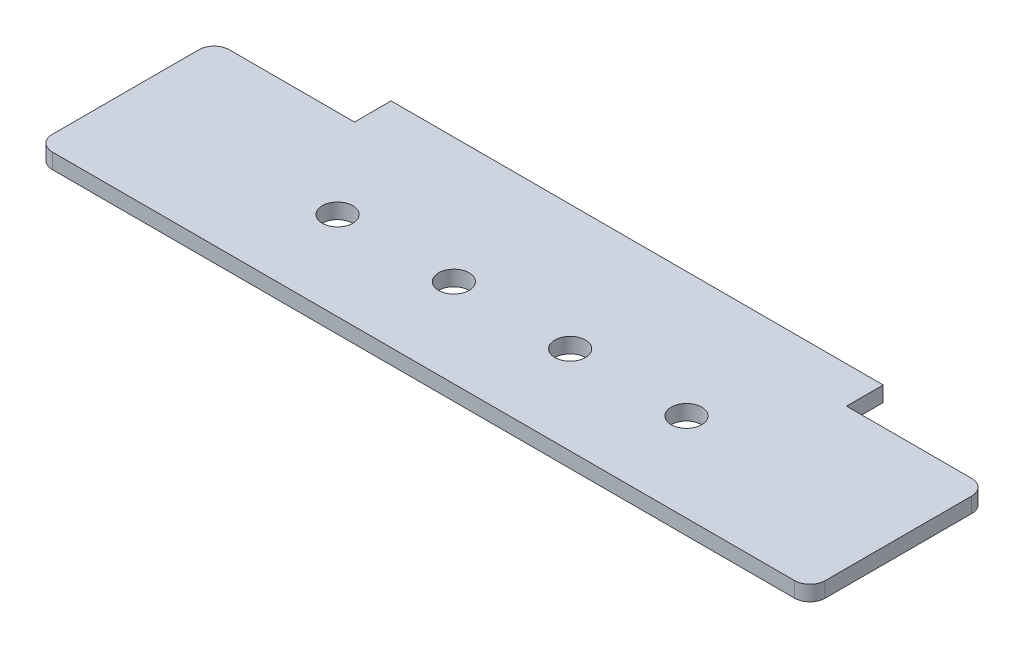
ISO-10303-21;
HEADER;
FILE_DESCRIPTION(('STEP AP214'),'2;1');
FILE_NAME('part.step','',(''),(''),'','','');
FILE_SCHEMA(('AUTOMOTIVE_DESIGN { 1 0 10303 214 1 1 1 1 }'));
ENDSEC;
DATA;
#1=APPLICATION_CONTEXT('core data for automotive mechanical design processes');
#2=APPLICATION_PROTOCOL_DEFINITION('international standard','automotive_design',2000,#1);
#3=PRODUCT_CONTEXT('',#1,'mechanical');
#4=PRODUCT('Part','Part','',(#3));
#5=PRODUCT_RELATED_PRODUCT_CATEGORY('part','',(#4));
#6=PRODUCT_DEFINITION_FORMATION('','',#4);
#7=PRODUCT_DEFINITION_CONTEXT('part definition',#1,'design');
#8=PRODUCT_DEFINITION('design','',#6,#7);
#9=PRODUCT_DEFINITION_SHAPE('','',#8);
#10=(LENGTH_UNIT() NAMED_UNIT(*) SI_UNIT(.MILLI.,.METRE.));
#11=(NAMED_UNIT(*) PLANE_ANGLE_UNIT() SI_UNIT($,.RADIAN.));
#12=(NAMED_UNIT(*) SI_UNIT($,.STERADIAN.) SOLID_ANGLE_UNIT());
#13=UNCERTAINTY_MEASURE_WITH_UNIT(LENGTH_MEASURE(1.E-05),#10,'distance_accuracy_value','');
#14=(GEOMETRIC_REPRESENTATION_CONTEXT(3) GLOBAL_UNCERTAINTY_ASSIGNED_CONTEXT((#13)) GLOBAL_UNIT_ASSIGNED_CONTEXT((#10,
#11,#12)) REPRESENTATION_CONTEXT('',''));
#15=CARTESIAN_POINT('',(0.,0.,0.));
#16=DIRECTION('',(0.,0.,1.));
#17=DIRECTION('',(1.,0.,0.));
#18=AXIS2_PLACEMENT_3D('',#15,#16,#17);
#19=CARTESIAN_POINT('',(-6.44499999999996,0.5,-2.40000000000001));
#20=DIRECTION('',(0.,1.,0.));
#21=DIRECTION('',(0.,0.,1.));
#22=AXIS2_PLACEMENT_3D('',#19,#20,#21);
#23=PLANE('',#22);
#24=CARTESIAN_POINT('',(7.62000000000001,0.5,0.));
#25=DIRECTION('',(0.,1.,0.));
#26=DIRECTION('',(0.,0.,1.));
#27=AXIS2_PLACEMENT_3D('',#24,#25,#26);
#28=CIRCLE('',#27,0.499999999999999);
#29=CARTESIAN_POINT('',(7.62000000000001,0.5,0.499999999999999));
#30=VERTEX_POINT('',#29);
#31=EDGE_CURVE('E332',#30,#30,#28,.T.);
#32=ORIENTED_EDGE('',*,*,#31,.F.);
#33=EDGE_LOOP('',(#32));
#34=FACE_BOUND('',#33,.T.);
#35=CARTESIAN_POINT('',(0.,0.5,0.));
#36=DIRECTION('',(0.,1.,0.));
#37=DIRECTION('',(0.,0.,1.));
#38=AXIS2_PLACEMENT_3D('',#35,#36,#37);
#39=CIRCLE('',#38,0.499999999999999);
#40=CARTESIAN_POINT('',(0.,0.5,0.499999999999999));
#41=VERTEX_POINT('',#40);
#42=EDGE_CURVE('E170',#41,#41,#39,.T.);
#43=ORIENTED_EDGE('',*,*,#42,.F.);
#44=EDGE_LOOP('',(#43));
#45=FACE_BOUND('',#44,.T.);
#46=DIRECTION('',(0.,0.,1.));
#47=VECTOR('',#46,1.);
#48=CARTESIAN_POINT('',(-2.34499999999997,0.5,-4.10000000000001));
#49=LINE('',#48,#47);
#50=CARTESIAN_POINT('',(-2.34499999999997,0.5,-4.10000000000001));
#51=VERTEX_POINT('',#50);
#52=CARTESIAN_POINT('',(-2.34499999999997,0.5,-2.89999999999999));
#53=VERTEX_POINT('',#52);
#54=EDGE_CURVE('E200',#51,#53,#49,.T.);
#55=ORIENTED_EDGE('',*,*,#54,.T.);
#56=DIRECTION('',(-1.,0.,0.));
#57=VECTOR('',#56,1.);
#58=CARTESIAN_POINT('',(-6.44499999999996,0.5,-2.90000000000001));
#59=LINE('',#58,#57);
#60=CARTESIAN_POINT('',(-6.44499999999996,0.5,-2.90000000000001));
#61=VERTEX_POINT('',#60);
#62=EDGE_CURVE('E112',#53,#61,#59,.T.);
#63=ORIENTED_EDGE('',*,*,#62,.T.);
#64=CARTESIAN_POINT('',(-6.44499999999996,0.5,-2.40000000000001));
#65=DIRECTION('',(0.,1.,0.));
#66=DIRECTION('',(0.,0.,1.));
#67=AXIS2_PLACEMENT_3D('',#64,#65,#66);
#68=CIRCLE('',#67,0.5);
#69=CARTESIAN_POINT('',(-6.94499999999996,0.5,-2.40000000000001));
#70=VERTEX_POINT('',#69);
#71=EDGE_CURVE('E237',#61,#70,#68,.T.);
#72=ORIENTED_EDGE('',*,*,#71,.T.);
#73=DIRECTION('',(0.,0.,1.));
#74=VECTOR('',#73,1.);
#75=CARTESIAN_POINT('',(-6.94499999999996,0.5,-2.40000000000001));
#76=LINE('',#75,#74);
#77=CARTESIAN_POINT('',(-6.94499999999996,0.5,2.39999999999998));
#78=VERTEX_POINT('',#77);
#79=EDGE_CURVE('E257',#70,#78,#76,.T.);
#80=ORIENTED_EDGE('',*,*,#79,.T.);
#81=CARTESIAN_POINT('',(-6.44499999999997,0.5,2.39999999999999));
#82=DIRECTION('',(0.,1.,0.));
#83=DIRECTION('',(0.,0.,1.));
#84=AXIS2_PLACEMENT_3D('',#81,#82,#83);
#85=CIRCLE('',#84,0.5);
#86=CARTESIAN_POINT('',(-6.44499999999996,0.5,2.89999999999999));
#87=VERTEX_POINT('',#86);
#88=EDGE_CURVE('E253',#78,#87,#85,.T.);
#89=ORIENTED_EDGE('',*,*,#88,.T.);
#90=DIRECTION('',(1.,0.,0.));
#91=VECTOR('',#90,1.);
#92=CARTESIAN_POINT('',(-6.44499999999996,0.5,2.89999999999999));
#93=LINE('',#92,#91);
#94=CARTESIAN_POINT('',(17.875,0.5,2.89999999999999));
#95=VERTEX_POINT('',#94);
#96=EDGE_CURVE('E256',#87,#95,#93,.T.);
#97=ORIENTED_EDGE('',*,*,#96,.T.);
#98=CARTESIAN_POINT('',(17.875,0.5,2.39999999999999));
#99=DIRECTION('',(0.,1.,0.));
#100=DIRECTION('',(0.,0.,1.));
#101=AXIS2_PLACEMENT_3D('',#98,#99,#100);
#102=CIRCLE('',#101,0.5);
#103=CARTESIAN_POINT('',(18.375,0.5,2.39999999999998));
#104=VERTEX_POINT('',#103);
#105=EDGE_CURVE('E261',#95,#104,#102,.T.);
#106=ORIENTED_EDGE('',*,*,#105,.T.);
#107=DIRECTION('',(0.,0.,-1.));
#108=VECTOR('',#107,1.);
#109=CARTESIAN_POINT('',(18.375,0.5,-2.4));
#110=LINE('',#109,#108);
#111=CARTESIAN_POINT('',(18.375,0.5,-2.4));
#112=VERTEX_POINT('',#111);
#113=EDGE_CURVE('E268',#104,#112,#110,.T.);
#114=ORIENTED_EDGE('',*,*,#113,.T.);
#115=CARTESIAN_POINT('',(17.875,0.5,-2.4));
#116=DIRECTION('',(0.,1.,0.));
#117=DIRECTION('',(0.,0.,-1.));
#118=AXIS2_PLACEMENT_3D('',#115,#116,#117);
#119=CIRCLE('',#118,0.5);
#120=CARTESIAN_POINT('',(17.875,0.5,-2.9));
#121=VERTEX_POINT('',#120);
#122=EDGE_CURVE('E143',#112,#121,#119,.T.);
#123=ORIENTED_EDGE('',*,*,#122,.T.);
#124=DIRECTION('',(-1.,0.,0.));
#125=VECTOR('',#124,1.);
#126=CARTESIAN_POINT('',(13.775,0.5,-2.89999999999999));
#127=LINE('',#126,#125);
#128=CARTESIAN_POINT('',(13.775,0.5,-2.89999999999999));
#129=VERTEX_POINT('',#128);
#130=EDGE_CURVE('E137',#121,#129,#127,.T.);
#131=ORIENTED_EDGE('',*,*,#130,.T.);
#132=DIRECTION('',(0.,0.,-1.));
#133=VECTOR('',#132,1.);
#134=CARTESIAN_POINT('',(13.775,0.5,-4.10000000000001));
#135=LINE('',#134,#133);
#136=CARTESIAN_POINT('',(13.775,0.5,-4.10000000000001));
#137=VERTEX_POINT('',#136);
#138=EDGE_CURVE('E141',#129,#137,#135,.T.);
#139=ORIENTED_EDGE('',*,*,#138,.T.);
#140=DIRECTION('',(-1.,0.,0.));
#141=VECTOR('',#140,1.);
#142=CARTESIAN_POINT('',(-2.34499999999997,0.5,-4.10000000000001));
#143=LINE('',#142,#141);
#144=EDGE_CURVE('E57',#137,#51,#143,.T.);
#145=ORIENTED_EDGE('',*,*,#144,.T.);
#146=EDGE_LOOP('',(#55,#63,#72,#80,#89,#97,#106,#114,#123,#131,#139,#145));
#147=FACE_BOUND('',#146,.T.);
#148=CARTESIAN_POINT('',(3.81,0.5,0.));
#149=DIRECTION('',(0.,1.,0.));
#150=DIRECTION('',(0.,0.,1.));
#151=AXIS2_PLACEMENT_3D('',#148,#149,#150);
#152=CIRCLE('',#151,0.499999999999999);
#153=CARTESIAN_POINT('',(3.81,0.5,0.499999999999999));
#154=VERTEX_POINT('',#153);
#155=EDGE_CURVE('E340',#154,#154,#152,.T.);
#156=ORIENTED_EDGE('',*,*,#155,.F.);
#157=EDGE_LOOP('',(#156));
#158=FACE_BOUND('',#157,.T.);
#159=CARTESIAN_POINT('',(11.43,0.5,0.));
#160=DIRECTION('',(0.,1.,0.));
#161=DIRECTION('',(0.,0.,1.));
#162=AXIS2_PLACEMENT_3D('',#159,#160,#161);
#163=CIRCLE('',#162,0.499999999999999);
#164=CARTESIAN_POINT('',(11.43,0.5,0.499999999999999));
#165=VERTEX_POINT('',#164);
#166=EDGE_CURVE('E321',#165,#165,#163,.T.);
#167=ORIENTED_EDGE('',*,*,#166,.F.);
#168=EDGE_LOOP('',(#167));
#169=FACE_BOUND('',#168,.T.);
#170=ADVANCED_FACE('F39',(#34,#45,#147,#158,#169),#23,.T.);
#171=CARTESIAN_POINT('',(-6.44499999999996,0.,-2.40000000000001));
#172=DIRECTION('',(0.,1.,0.));
#173=DIRECTION('',(0.,0.,1.));
#174=AXIS2_PLACEMENT_3D('',#171,#172,#173);
#175=PLANE('',#174);
#176=DIRECTION('',(0.,0.,1.));
#177=VECTOR('',#176,1.);
#178=CARTESIAN_POINT('',(-2.34499999999997,0.,-4.10000000000001));
#179=LINE('',#178,#177);
#180=CARTESIAN_POINT('',(-2.34499999999997,0.,-4.10000000000001));
#181=VERTEX_POINT('',#180);
#182=CARTESIAN_POINT('',(-2.34499999999997,0.,-2.89999999999999));
#183=VERTEX_POINT('',#182);
#184=EDGE_CURVE('E165',#181,#183,#179,.T.);
#185=ORIENTED_EDGE('',*,*,#184,.F.);
#186=DIRECTION('',(-1.,0.,0.));
#187=VECTOR('',#186,1.);
#188=CARTESIAN_POINT('',(-2.34499999999997,0.,-4.10000000000001));
#189=LINE('',#188,#187);
#190=CARTESIAN_POINT('',(13.775,0.,-4.10000000000001));
#191=VERTEX_POINT('',#190);
#192=EDGE_CURVE('E104',#191,#181,#189,.T.);
#193=ORIENTED_EDGE('',*,*,#192,.F.);
#194=DIRECTION('',(0.,0.,-1.));
#195=VECTOR('',#194,1.);
#196=CARTESIAN_POINT('',(13.775,0.,-4.10000000000001));
#197=LINE('',#196,#195);
#198=CARTESIAN_POINT('',(13.775,0.,-2.89999999999999));
#199=VERTEX_POINT('',#198);
#200=EDGE_CURVE('E98',#199,#191,#197,.T.);
#201=ORIENTED_EDGE('',*,*,#200,.F.);
#202=DIRECTION('',(-1.,0.,0.));
#203=VECTOR('',#202,1.);
#204=CARTESIAN_POINT('',(13.775,0.,-2.89999999999999));
#205=LINE('',#204,#203);
#206=CARTESIAN_POINT('',(17.875,0.,-2.9));
#207=VERTEX_POINT('',#206);
#208=EDGE_CURVE('E152',#207,#199,#205,.T.);
#209=ORIENTED_EDGE('',*,*,#208,.F.);
#210=CARTESIAN_POINT('',(17.875,0.,-2.4));
#211=DIRECTION('',(0.,1.,0.));
#212=DIRECTION('',(0.,0.,-1.));
#213=AXIS2_PLACEMENT_3D('',#210,#211,#212);
#214=CIRCLE('',#213,0.5);
#215=CARTESIAN_POINT('',(18.375,0.,-2.4));
#216=VERTEX_POINT('',#215);
#217=EDGE_CURVE('E191',#216,#207,#214,.T.);
#218=ORIENTED_EDGE('',*,*,#217,.F.);
#219=DIRECTION('',(0.,0.,-1.));
#220=VECTOR('',#219,1.);
#221=CARTESIAN_POINT('',(18.375,0.,-2.4));
#222=LINE('',#221,#220);
#223=CARTESIAN_POINT('',(18.375,0.,2.39999999999998));
#224=VERTEX_POINT('',#223);
#225=EDGE_CURVE('E188',#224,#216,#222,.T.);
#226=ORIENTED_EDGE('',*,*,#225,.F.);
#227=CARTESIAN_POINT('',(17.875,0.,2.39999999999999));
#228=DIRECTION('',(0.,1.,0.));
#229=DIRECTION('',(0.,0.,1.));
#230=AXIS2_PLACEMENT_3D('',#227,#228,#229);
#231=CIRCLE('',#230,0.5);
#232=CARTESIAN_POINT('',(17.875,0.,2.89999999999999));
#233=VERTEX_POINT('',#232);
#234=EDGE_CURVE('E185',#233,#224,#231,.T.);
#235=ORIENTED_EDGE('',*,*,#234,.F.);
#236=DIRECTION('',(1.,0.,0.));
#237=VECTOR('',#236,1.);
#238=CARTESIAN_POINT('',(-6.44499999999996,0.,2.89999999999999));
#239=LINE('',#238,#237);
#240=CARTESIAN_POINT('',(-6.44499999999996,0.,2.89999999999999));
#241=VERTEX_POINT('',#240);
#242=EDGE_CURVE('E182',#241,#233,#239,.T.);
#243=ORIENTED_EDGE('',*,*,#242,.F.);
#244=CARTESIAN_POINT('',(-6.44499999999997,0.,2.39999999999999));
#245=DIRECTION('',(0.,1.,0.));
#246=DIRECTION('',(0.,0.,1.));
#247=AXIS2_PLACEMENT_3D('',#244,#245,#246);
#248=CIRCLE('',#247,0.5);
#249=CARTESIAN_POINT('',(-6.94499999999996,0.,2.39999999999998));
#250=VERTEX_POINT('',#249);
#251=EDGE_CURVE('E179',#250,#241,#248,.T.);
#252=ORIENTED_EDGE('',*,*,#251,.F.);
#253=DIRECTION('',(0.,0.,1.));
#254=VECTOR('',#253,1.);
#255=CARTESIAN_POINT('',(-6.94499999999996,0.,-2.40000000000001));
#256=LINE('',#255,#254);
#257=CARTESIAN_POINT('',(-6.94499999999996,0.,-2.40000000000001));
#258=VERTEX_POINT('',#257);
#259=EDGE_CURVE('E176',#258,#250,#256,.T.);
#260=ORIENTED_EDGE('',*,*,#259,.F.);
#261=CARTESIAN_POINT('',(-6.44499999999996,0.,-2.40000000000001));
#262=DIRECTION('',(0.,1.,0.));
#263=DIRECTION('',(0.,0.,1.));
#264=AXIS2_PLACEMENT_3D('',#261,#262,#263);
#265=CIRCLE('',#264,0.5);
#266=CARTESIAN_POINT('',(-6.44499999999996,0.,-2.90000000000001));
#267=VERTEX_POINT('',#266);
#268=EDGE_CURVE('E173',#267,#258,#265,.T.);
#269=ORIENTED_EDGE('',*,*,#268,.F.);
#270=DIRECTION('',(-1.,0.,0.));
#271=VECTOR('',#270,1.);
#272=CARTESIAN_POINT('',(-6.44499999999996,0.,-2.90000000000001));
#273=LINE('',#272,#271);
#274=EDGE_CURVE('E169',#183,#267,#273,.T.);
#275=ORIENTED_EDGE('',*,*,#274,.F.);
#276=EDGE_LOOP('',(#185,#193,#201,#209,#218,#226,#235,#243,#252,#260,#269,#275));
#277=FACE_BOUND('',#276,.T.);
#278=CARTESIAN_POINT('',(0.,0.,0.));
#279=DIRECTION('',(0.,1.,0.));
#280=DIRECTION('',(0.,0.,1.));
#281=AXIS2_PLACEMENT_3D('',#278,#279,#280);
#282=CIRCLE('',#281,0.499999999999999);
#283=CARTESIAN_POINT('',(0.,0.,0.499999999999999));
#284=VERTEX_POINT('',#283);
#285=EDGE_CURVE('E344',#284,#284,#282,.T.);
#286=ORIENTED_EDGE('',*,*,#285,.T.);
#287=EDGE_LOOP('',(#286));
#288=FACE_BOUND('',#287,.T.);
#289=CARTESIAN_POINT('',(3.81,0.,0.));
#290=DIRECTION('',(0.,1.,0.));
#291=DIRECTION('',(0.,0.,1.));
#292=AXIS2_PLACEMENT_3D('',#289,#290,#291);
#293=CIRCLE('',#292,0.499999999999999);
#294=CARTESIAN_POINT('',(3.81,0.,0.499999999999999));
#295=VERTEX_POINT('',#294);
#296=EDGE_CURVE('E336',#295,#295,#293,.T.);
#297=ORIENTED_EDGE('',*,*,#296,.T.);
#298=EDGE_LOOP('',(#297));
#299=FACE_BOUND('',#298,.T.);
#300=CARTESIAN_POINT('',(7.62000000000001,0.,0.));
#301=DIRECTION('',(0.,1.,0.));
#302=DIRECTION('',(0.,0.,1.));
#303=AXIS2_PLACEMENT_3D('',#300,#301,#302);
#304=CIRCLE('',#303,0.499999999999999);
#305=CARTESIAN_POINT('',(7.62000000000001,0.,0.499999999999999));
#306=VERTEX_POINT('',#305);
#307=EDGE_CURVE('E329',#306,#306,#304,.T.);
#308=ORIENTED_EDGE('',*,*,#307,.T.);
#309=EDGE_LOOP('',(#308));
#310=FACE_BOUND('',#309,.T.);
#311=CARTESIAN_POINT('',(11.43,0.,0.));
#312=DIRECTION('',(0.,1.,0.));
#313=DIRECTION('',(0.,0.,1.));
#314=AXIS2_PLACEMENT_3D('',#311,#312,#313);
#315=CIRCLE('',#314,0.499999999999999);
#316=CARTESIAN_POINT('',(11.43,0.,0.499999999999999));
#317=VERTEX_POINT('',#316);
#318=EDGE_CURVE('E324',#317,#317,#315,.T.);
#319=ORIENTED_EDGE('',*,*,#318,.T.);
#320=EDGE_LOOP('',(#319));
#321=FACE_BOUND('',#320,.T.);
#322=ADVANCED_FACE('F241',(#277,#288,#299,#310,#321),#175,.F.);
#323=CARTESIAN_POINT('',(-2.34499999999997,0.5,-4.10000000000001));
#324=DIRECTION('',(1.,0.,0.));
#325=DIRECTION('',(0.,0.,-1.));
#326=AXIS2_PLACEMENT_3D('',#323,#324,#325);
#327=PLANE('',#326);
#328=ORIENTED_EDGE('',*,*,#184,.T.);
#329=DIRECTION('',(0.,-1.,0.));
#330=VECTOR('',#329,1.);
#331=CARTESIAN_POINT('',(-2.34499999999997,0.5,-2.89999999999999));
#332=LINE('',#331,#330);
#333=EDGE_CURVE('E11',#53,#183,#332,.T.);
#334=ORIENTED_EDGE('',*,*,#333,.F.);
#335=ORIENTED_EDGE('',*,*,#54,.F.);
#336=DIRECTION('',(0.,-1.,0.));
#337=VECTOR('',#336,1.);
#338=CARTESIAN_POINT('',(-2.34499999999997,0.5,-4.10000000000001));
#339=LINE('',#338,#337);
#340=EDGE_CURVE('E161',#51,#181,#339,.T.);
#341=ORIENTED_EDGE('',*,*,#340,.T.);
#342=EDGE_LOOP('',(#328,#334,#335,#341));
#343=FACE_BOUND('',#342,.T.);
#344=ADVANCED_FACE('F41',(#343),#327,.F.);
#345=CARTESIAN_POINT('',(-6.44499999999996,0.5,-2.90000000000001));
#346=DIRECTION('',(0.,0.,1.));
#347=DIRECTION('',(1.,0.,0.));
#348=AXIS2_PLACEMENT_3D('',#345,#346,#347);
#349=PLANE('',#348);
#350=ORIENTED_EDGE('',*,*,#274,.T.);
#351=DIRECTION('',(0.,-1.,0.));
#352=VECTOR('',#351,1.);
#353=CARTESIAN_POINT('',(-6.44499999999996,0.5,-2.90000000000001));
#354=LINE('',#353,#352);
#355=EDGE_CURVE('E49',#61,#267,#354,.T.);
#356=ORIENTED_EDGE('',*,*,#355,.F.);
#357=ORIENTED_EDGE('',*,*,#62,.F.);
#358=ORIENTED_EDGE('',*,*,#333,.T.);
#359=EDGE_LOOP('',(#350,#356,#357,#358));
#360=FACE_BOUND('',#359,.T.);
#361=ADVANCED_FACE('F460',(#360),#349,.F.);
#362=CARTESIAN_POINT('',(-6.44499999999996,0.5,-2.40000000000001));
#363=DIRECTION('',(0.,-1.,0.));
#364=DIRECTION('',(0.,0.,-1.));
#365=AXIS2_PLACEMENT_3D('',#362,#363,#364);
#366=CYLINDRICAL_SURFACE('',#365,0.5);
#367=ORIENTED_EDGE('',*,*,#268,.T.);
#368=DIRECTION('',(0.,-1.,0.));
#369=VECTOR('',#368,1.);
#370=CARTESIAN_POINT('',(-6.94499999999996,0.5,-2.40000000000001));
#371=LINE('',#370,#369);
#372=EDGE_CURVE('E227',#70,#258,#371,.T.);
#373=ORIENTED_EDGE('',*,*,#372,.F.);
#374=ORIENTED_EDGE('',*,*,#71,.F.);
#375=ORIENTED_EDGE('',*,*,#355,.T.);
#376=EDGE_LOOP('',(#367,#373,#374,#375));
#377=FACE_BOUND('',#376,.T.);
#378=ADVANCED_FACE('F235',(#377),#366,.T.);
#379=CARTESIAN_POINT('',(-6.94499999999996,0.5,-2.40000000000001));
#380=DIRECTION('',(1.,0.,0.));
#381=DIRECTION('',(0.,0.,-1.));
#382=AXIS2_PLACEMENT_3D('',#379,#380,#381);
#383=PLANE('',#382);
#384=ORIENTED_EDGE('',*,*,#259,.T.);
#385=DIRECTION('',(0.,-1.,0.));
#386=VECTOR('',#385,1.);
#387=CARTESIAN_POINT('',(-6.94499999999996,0.5,2.39999999999998));
#388=LINE('',#387,#386);
#389=EDGE_CURVE('E223',#78,#250,#388,.T.);
#390=ORIENTED_EDGE('',*,*,#389,.F.);
#391=ORIENTED_EDGE('',*,*,#79,.F.);
#392=ORIENTED_EDGE('',*,*,#372,.T.);
#393=EDGE_LOOP('',(#384,#390,#391,#392));
#394=FACE_BOUND('',#393,.T.);
#395=ADVANCED_FACE('F247',(#394),#383,.F.);
#396=CARTESIAN_POINT('',(-6.44499999999997,0.5,2.39999999999999));
#397=DIRECTION('',(0.,-1.,0.));
#398=DIRECTION('',(0.,0.,-1.));
#399=AXIS2_PLACEMENT_3D('',#396,#397,#398);
#400=CYLINDRICAL_SURFACE('',#399,0.5);
#401=ORIENTED_EDGE('',*,*,#251,.T.);
#402=DIRECTION('',(0.,-1.,0.));
#403=VECTOR('',#402,1.);
#404=CARTESIAN_POINT('',(-6.44499999999996,0.5,2.89999999999999));
#405=LINE('',#404,#403);
#406=EDGE_CURVE('E219',#87,#241,#405,.T.);
#407=ORIENTED_EDGE('',*,*,#406,.F.);
#408=ORIENTED_EDGE('',*,*,#88,.F.);
#409=ORIENTED_EDGE('',*,*,#389,.T.);
#410=EDGE_LOOP('',(#401,#407,#408,#409));
#411=FACE_BOUND('',#410,.T.);
#412=ADVANCED_FACE('F251',(#411),#400,.T.);
#413=CARTESIAN_POINT('',(-6.44499999999996,0.5,2.89999999999999));
#414=DIRECTION('',(0.,0.,-1.));
#415=DIRECTION('',(-1.,0.,0.));
#416=AXIS2_PLACEMENT_3D('',#413,#414,#415);
#417=PLANE('',#416);
#418=ORIENTED_EDGE('',*,*,#242,.T.);
#419=DIRECTION('',(0.,-1.,0.));
#420=VECTOR('',#419,1.);
#421=CARTESIAN_POINT('',(17.875,0.5,2.89999999999999));
#422=LINE('',#421,#420);
#423=EDGE_CURVE('E215',#95,#233,#422,.T.);
#424=ORIENTED_EDGE('',*,*,#423,.F.);
#425=ORIENTED_EDGE('',*,*,#96,.F.);
#426=ORIENTED_EDGE('',*,*,#406,.T.);
#427=EDGE_LOOP('',(#418,#424,#425,#426));
#428=FACE_BOUND('',#427,.T.);
#429=ADVANCED_FACE('F425',(#428),#417,.F.);
#430=CARTESIAN_POINT('',(17.875,0.5,2.39999999999999));
#431=DIRECTION('',(0.,-1.,0.));
#432=DIRECTION('',(0.,0.,-1.));
#433=AXIS2_PLACEMENT_3D('',#430,#431,#432);
#434=CYLINDRICAL_SURFACE('',#433,0.5);
#435=ORIENTED_EDGE('',*,*,#234,.T.);
#436=DIRECTION('',(0.,-1.,0.));
#437=VECTOR('',#436,1.);
#438=CARTESIAN_POINT('',(18.375,0.5,2.39999999999998));
#439=LINE('',#438,#437);
#440=EDGE_CURVE('E211',#104,#224,#439,.T.);
#441=ORIENTED_EDGE('',*,*,#440,.F.);
#442=ORIENTED_EDGE('',*,*,#105,.F.);
#443=ORIENTED_EDGE('',*,*,#423,.T.);
#444=EDGE_LOOP('',(#435,#441,#442,#443));
#445=FACE_BOUND('',#444,.T.);
#446=ADVANCED_FACE('F416',(#445),#434,.T.);
#447=CARTESIAN_POINT('',(18.375,0.5,-2.4));
#448=DIRECTION('',(-1.,0.,0.));
#449=DIRECTION('',(0.,0.,1.));
#450=AXIS2_PLACEMENT_3D('',#447,#448,#449);
#451=PLANE('',#450);
#452=ORIENTED_EDGE('',*,*,#225,.T.);
#453=DIRECTION('',(0.,-1.,0.));
#454=VECTOR('',#453,1.);
#455=CARTESIAN_POINT('',(18.375,0.5,-2.4));
#456=LINE('',#455,#454);
#457=EDGE_CURVE('E207',#112,#216,#456,.T.);
#458=ORIENTED_EDGE('',*,*,#457,.F.);
#459=ORIENTED_EDGE('',*,*,#113,.F.);
#460=ORIENTED_EDGE('',*,*,#440,.T.);
#461=EDGE_LOOP('',(#452,#458,#459,#460));
#462=FACE_BOUND('',#461,.T.);
#463=ADVANCED_FACE('F276',(#462),#451,.F.);
#464=CARTESIAN_POINT('',(17.875,0.5,-2.4));
#465=DIRECTION('',(0.,-1.,0.));
#466=DIRECTION('',(0.,0.,-1.));
#467=AXIS2_PLACEMENT_3D('',#464,#465,#466);
#468=CYLINDRICAL_SURFACE('',#467,0.5);
#469=ORIENTED_EDGE('',*,*,#217,.T.);
#470=DIRECTION('',(0.,-1.,0.));
#471=VECTOR('',#470,1.);
#472=CARTESIAN_POINT('',(17.875,0.5,-2.9));
#473=LINE('',#472,#471);
#474=EDGE_CURVE('E154',#121,#207,#473,.T.);
#475=ORIENTED_EDGE('',*,*,#474,.F.);
#476=ORIENTED_EDGE('',*,*,#122,.F.);
#477=ORIENTED_EDGE('',*,*,#457,.T.);
#478=EDGE_LOOP('',(#469,#475,#476,#477));
#479=FACE_BOUND('',#478,.T.);
#480=ADVANCED_FACE('F280',(#479),#468,.T.);
#481=CARTESIAN_POINT('',(13.775,0.5,-2.89999999999999));
#482=DIRECTION('',(0.,0.,1.));
#483=DIRECTION('',(1.,0.,0.));
#484=AXIS2_PLACEMENT_3D('',#481,#482,#483);
#485=PLANE('',#484);
#486=ORIENTED_EDGE('',*,*,#208,.T.);
#487=DIRECTION('',(0.,-1.,0.));
#488=VECTOR('',#487,1.);
#489=CARTESIAN_POINT('',(13.775,0.5,-2.89999999999999));
#490=LINE('',#489,#488);
#491=EDGE_CURVE('E149',#129,#199,#490,.T.);
#492=ORIENTED_EDGE('',*,*,#491,.F.);
#493=ORIENTED_EDGE('',*,*,#130,.F.);
#494=ORIENTED_EDGE('',*,*,#474,.T.);
#495=EDGE_LOOP('',(#486,#492,#493,#494));
#496=FACE_BOUND('',#495,.T.);
#497=ADVANCED_FACE('F150',(#496),#485,.F.);
#498=CARTESIAN_POINT('',(13.775,0.5,-4.10000000000001));
#499=DIRECTION('',(-1.,0.,0.));
#500=DIRECTION('',(0.,0.,1.));
#501=AXIS2_PLACEMENT_3D('',#498,#499,#500);
#502=PLANE('',#501);
#503=ORIENTED_EDGE('',*,*,#200,.T.);
#504=DIRECTION('',(0.,-1.,0.));
#505=VECTOR('',#504,1.);
#506=CARTESIAN_POINT('',(13.775,0.5,-4.10000000000001));
#507=LINE('',#506,#505);
#508=EDGE_CURVE('E155',#137,#191,#507,.T.);
#509=ORIENTED_EDGE('',*,*,#508,.F.);
#510=ORIENTED_EDGE('',*,*,#138,.F.);
#511=ORIENTED_EDGE('',*,*,#491,.T.);
#512=EDGE_LOOP('',(#503,#509,#510,#511));
#513=FACE_BOUND('',#512,.T.);
#514=ADVANCED_FACE('F157',(#513),#502,.F.);
#515=CARTESIAN_POINT('',(-2.34499999999997,0.5,-4.10000000000001));
#516=DIRECTION('',(0.,0.,1.));
#517=DIRECTION('',(1.,0.,0.));
#518=AXIS2_PLACEMENT_3D('',#515,#516,#517);
#519=PLANE('',#518);
#520=ORIENTED_EDGE('',*,*,#192,.T.);
#521=ORIENTED_EDGE('',*,*,#340,.F.);
#522=ORIENTED_EDGE('',*,*,#144,.F.);
#523=ORIENTED_EDGE('',*,*,#508,.T.);
#524=EDGE_LOOP('',(#520,#521,#522,#523));
#525=FACE_BOUND('',#524,.T.);
#526=ADVANCED_FACE('F284',(#525),#519,.F.);
#527=CARTESIAN_POINT('',(0.,0.5,0.));
#528=DIRECTION('',(0.,-1.,0.));
#529=DIRECTION('',(0.,0.,-1.));
#530=AXIS2_PLACEMENT_3D('',#527,#528,#529);
#531=CYLINDRICAL_SURFACE('',#530,0.499999999999999);
#532=ORIENTED_EDGE('',*,*,#42,.T.);
#533=EDGE_LOOP('',(#532));
#534=FACE_BOUND('',#533,.T.);
#535=ORIENTED_EDGE('',*,*,#285,.F.);
#536=EDGE_LOOP('',(#535));
#537=FACE_BOUND('',#536,.T.);
#538=ADVANCED_FACE('F286',(#534,#537),#531,.F.);
#539=CARTESIAN_POINT('',(3.81,0.5,0.));
#540=DIRECTION('',(0.,-1.,0.));
#541=DIRECTION('',(0.,0.,-1.));
#542=AXIS2_PLACEMENT_3D('',#539,#540,#541);
#543=CYLINDRICAL_SURFACE('',#542,0.499999999999999);
#544=ORIENTED_EDGE('',*,*,#155,.T.);
#545=EDGE_LOOP('',(#544));
#546=FACE_BOUND('',#545,.T.);
#547=ORIENTED_EDGE('',*,*,#296,.F.);
#548=EDGE_LOOP('',(#547));
#549=FACE_BOUND('',#548,.T.);
#550=ADVANCED_FACE('F292',(#546,#549),#543,.F.);
#551=CARTESIAN_POINT('',(7.62000000000001,0.5,0.));
#552=DIRECTION('',(0.,-1.,0.));
#553=DIRECTION('',(0.,0.,-1.));
#554=AXIS2_PLACEMENT_3D('',#551,#552,#553);
#555=CYLINDRICAL_SURFACE('',#554,0.499999999999999);
#556=ORIENTED_EDGE('',*,*,#31,.T.);
#557=EDGE_LOOP('',(#556));
#558=FACE_BOUND('',#557,.T.);
#559=ORIENTED_EDGE('',*,*,#307,.F.);
#560=EDGE_LOOP('',(#559));
#561=FACE_BOUND('',#560,.T.);
#562=ADVANCED_FACE('F308',(#558,#561),#555,.F.);
#563=CARTESIAN_POINT('',(11.43,0.5,0.));
#564=DIRECTION('',(0.,-1.,0.));
#565=DIRECTION('',(0.,0.,-1.));
#566=AXIS2_PLACEMENT_3D('',#563,#564,#565);
#567=CYLINDRICAL_SURFACE('',#566,0.499999999999999);
#568=ORIENTED_EDGE('',*,*,#166,.T.);
#569=EDGE_LOOP('',(#568));
#570=FACE_BOUND('',#569,.T.);
#571=ORIENTED_EDGE('',*,*,#318,.F.);
#572=EDGE_LOOP('',(#571));
#573=FACE_BOUND('',#572,.T.);
#574=ADVANCED_FACE('F312',(#570,#573),#567,.F.);
#575=CLOSED_SHELL('',(#170,#322,#344,#361,#378,#395,#412,#429,#446,#463,#480,#497,#514,#526,
#538,#550,#562,#574));
#576=MANIFOLD_SOLID_BREP('B2',#575);
#577=ADVANCED_BREP_SHAPE_REPRESENTATION('',(#18,#576),#14);
#578=SHAPE_DEFINITION_REPRESENTATION(#9,#577);
ENDSEC;
END-ISO-10303-21;
